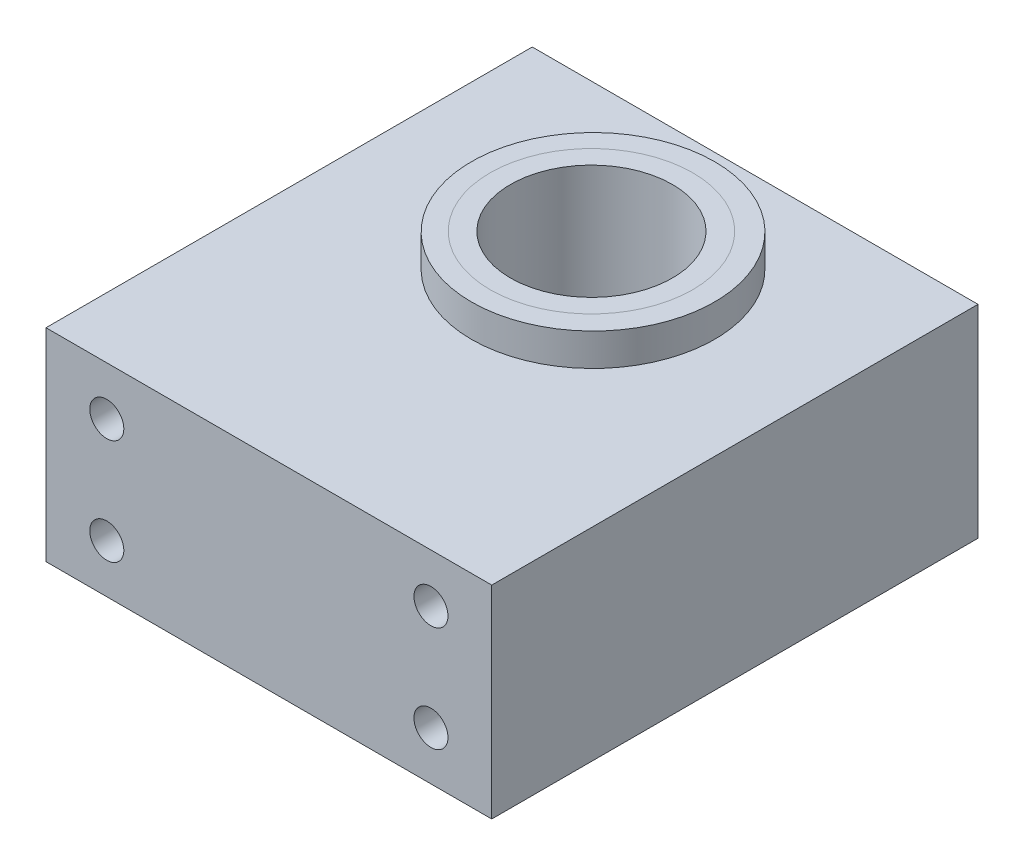
ISO-10303-21;
HEADER;
FILE_DESCRIPTION(('STEP AP214'),'2;1');
FILE_NAME('part.step','',(''),(''),'','','');
FILE_SCHEMA(('AUTOMOTIVE_DESIGN { 1 0 10303 214 1 1 1 1 }'));
ENDSEC;
DATA;
#1=APPLICATION_CONTEXT('core data for automotive mechanical design processes');
#2=APPLICATION_PROTOCOL_DEFINITION('international standard','automotive_design',2000,#1);
#3=PRODUCT_CONTEXT('',#1,'mechanical');
#4=PRODUCT('Part','Part','',(#3));
#5=PRODUCT_RELATED_PRODUCT_CATEGORY('part','',(#4));
#6=PRODUCT_DEFINITION_FORMATION('','',#4);
#7=PRODUCT_DEFINITION_CONTEXT('part definition',#1,'design');
#8=PRODUCT_DEFINITION('design','',#6,#7);
#9=PRODUCT_DEFINITION_SHAPE('','',#8);
#10=(LENGTH_UNIT() NAMED_UNIT(*) SI_UNIT(.MILLI.,.METRE.));
#11=(NAMED_UNIT(*) PLANE_ANGLE_UNIT() SI_UNIT($,.RADIAN.));
#12=(NAMED_UNIT(*) SI_UNIT($,.STERADIAN.) SOLID_ANGLE_UNIT());
#13=UNCERTAINTY_MEASURE_WITH_UNIT(LENGTH_MEASURE(1.E-05),#10,'distance_accuracy_value','');
#14=(GEOMETRIC_REPRESENTATION_CONTEXT(3) GLOBAL_UNCERTAINTY_ASSIGNED_CONTEXT((#13)) GLOBAL_UNIT_ASSIGNED_CONTEXT((#10,
#11,#12)) REPRESENTATION_CONTEXT('',''));
#15=CARTESIAN_POINT('',(0.,0.,0.));
#16=DIRECTION('',(0.,0.,1.));
#17=DIRECTION('',(1.,0.,0.));
#18=AXIS2_PLACEMENT_3D('',#15,#16,#17);
#19=CARTESIAN_POINT('',(-0.316230532057871,128.710678118655,0.0774764803540193));
#20=DIRECTION('',(0.,-1.,0.));
#21=DIRECTION('',(0.,0.,-1.));
#22=AXIS2_PLACEMENT_3D('',#19,#20,#21);
#23=CYLINDRICAL_SURFACE('',#22,25.);
#24=CARTESIAN_POINT('',(-0.316230532057871,0.,0.0774764803540193));
#25=DIRECTION('',(0.,1.,0.));
#26=DIRECTION('',(0.,0.,1.));
#27=AXIS2_PLACEMENT_3D('',#24,#25,#26);
#28=CIRCLE('',#27,25.);
#29=CARTESIAN_POINT('',(-0.316230532057871,0.,25.077476480354));
#30=VERTEX_POINT('',#29);
#31=EDGE_CURVE('E59',#30,#30,#28,.T.);
#32=ORIENTED_EDGE('',*,*,#31,.T.);
#33=EDGE_LOOP('',(#32));
#34=FACE_BOUND('',#33,.T.);
#35=CARTESIAN_POINT('',(-0.316230532057871,58.,0.0774764803540193));
#36=DIRECTION('',(0.,1.,0.));
#37=DIRECTION('',(0.,0.,1.));
#38=AXIS2_PLACEMENT_3D('',#35,#36,#37);
#39=CIRCLE('',#38,25.);
#40=CARTESIAN_POINT('',(-0.316230532057871,58.,25.077476480354));
#41=VERTEX_POINT('',#40);
#42=EDGE_CURVE('E11',#41,#41,#39,.T.);
#43=ORIENTED_EDGE('',*,*,#42,.F.);
#44=EDGE_LOOP('',(#43));
#45=FACE_BOUND('',#44,.T.);
#46=ADVANCED_FACE('F51',(#34,#45),#23,.T.);
#47=CARTESIAN_POINT('',(-0.316230532057871,0.,0.0774764803540193));
#48=DIRECTION('',(0.,1.,0.));
#49=DIRECTION('',(0.,0.,1.));
#50=AXIS2_PLACEMENT_3D('',#47,#48,#49);
#51=PLANE('',#50);
#52=ORIENTED_EDGE('',*,*,#31,.F.);
#53=EDGE_LOOP('',(#52));
#54=FACE_BOUND('',#53,.T.);
#55=CARTESIAN_POINT('',(-0.316230532057871,0.,0.0774764803540193));
#56=DIRECTION('',(0.,1.,0.));
#57=DIRECTION('',(0.,0.,1.));
#58=AXIS2_PLACEMENT_3D('',#55,#56,#57);
#59=CIRCLE('',#58,20.);
#60=CARTESIAN_POINT('',(-0.316230532057871,0.,20.077476480354));
#61=VERTEX_POINT('',#60);
#62=EDGE_CURVE('E65',#61,#61,#59,.T.);
#63=ORIENTED_EDGE('',*,*,#62,.T.);
#64=EDGE_LOOP('',(#63));
#65=FACE_BOUND('',#64,.T.);
#66=ADVANCED_FACE('F79',(#54,#65),#51,.F.);
#67=CARTESIAN_POINT('',(-0.316230532057871,128.710678118655,0.0774764803540193));
#68=DIRECTION('',(0.,-1.,0.));
#69=DIRECTION('',(0.,0.,-1.));
#70=AXIS2_PLACEMENT_3D('',#67,#68,#69);
#71=CYLINDRICAL_SURFACE('',#70,20.);
#72=ORIENTED_EDGE('',*,*,#62,.F.);
#73=EDGE_LOOP('',(#72));
#74=FACE_BOUND('',#73,.T.);
#75=CARTESIAN_POINT('',(-0.316230532057871,58.,0.0774764803540193));
#76=DIRECTION('',(0.,1.,0.));
#77=DIRECTION('',(0.,0.,1.));
#78=AXIS2_PLACEMENT_3D('',#75,#76,#77);
#79=CIRCLE('',#78,20.);
#80=CARTESIAN_POINT('',(-0.316230532057871,58.,20.077476480354));
#81=VERTEX_POINT('',#80);
#82=EDGE_CURVE('E53',#81,#81,#79,.T.);
#83=ORIENTED_EDGE('',*,*,#82,.T.);
#84=EDGE_LOOP('',(#83));
#85=FACE_BOUND('',#84,.T.);
#86=ADVANCED_FACE('F71',(#74,#85),#71,.F.);
#87=CARTESIAN_POINT('',(0.,58.,0.));
#88=DIRECTION('',(0.,1.,0.));
#89=DIRECTION('',(0.,0.,1.));
#90=AXIS2_PLACEMENT_3D('',#87,#88,#89);
#91=PLANE('',#90);
#92=ORIENTED_EDGE('',*,*,#82,.F.);
#93=EDGE_LOOP('',(#92));
#94=FACE_BOUND('',#93,.T.);
#95=ORIENTED_EDGE('',*,*,#42,.T.);
#96=EDGE_LOOP('',(#95));
#97=FACE_BOUND('',#96,.T.);
#98=ADVANCED_FACE('F73',(#94,#97),#91,.T.);
#99=CLOSED_SHELL('',(#46,#66,#86,#98));
#100=MANIFOLD_SOLID_BREP('B2',#99);
#101=CARTESIAN_POINT('',(-55.,50.,-40.));
#102=DIRECTION('',(1.,0.,0.));
#103=DIRECTION('',(0.,0.,-1.));
#104=AXIS2_PLACEMENT_3D('',#101,#102,#103);
#105=PLANE('',#104);
#106=DIRECTION('',(0.,0.,1.));
#107=VECTOR('',#106,1.);
#108=CARTESIAN_POINT('',(-55.,0.,-40.));
#109=LINE('',#108,#107);
#110=CARTESIAN_POINT('',(-55.,0.,-40.));
#111=VERTEX_POINT('',#110);
#112=CARTESIAN_POINT('',(-55.,0.,80.));
#113=VERTEX_POINT('',#112);
#114=EDGE_CURVE('E177',#111,#113,#109,.T.);
#115=ORIENTED_EDGE('',*,*,#114,.T.);
#116=DIRECTION('',(0.,-1.,0.));
#117=VECTOR('',#116,1.);
#118=CARTESIAN_POINT('',(-55.,50.,80.));
#119=LINE('',#118,#117);
#120=CARTESIAN_POINT('',(-55.,50.,80.));
#121=VERTEX_POINT('',#120);
#122=EDGE_CURVE('E116',#121,#113,#119,.T.);
#123=ORIENTED_EDGE('',*,*,#122,.F.);
#124=DIRECTION('',(0.,0.,1.));
#125=VECTOR('',#124,1.);
#126=CARTESIAN_POINT('',(-55.,50.,-40.));
#127=LINE('',#126,#125);
#128=CARTESIAN_POINT('',(-55.,50.,-40.));
#129=VERTEX_POINT('',#128);
#130=EDGE_CURVE('E168',#129,#121,#127,.T.);
#131=ORIENTED_EDGE('',*,*,#130,.F.);
#132=DIRECTION('',(0.,-1.,0.));
#133=VECTOR('',#132,1.);
#134=CARTESIAN_POINT('',(-55.,50.,-40.));
#135=LINE('',#134,#133);
#136=EDGE_CURVE('E174',#129,#111,#135,.T.);
#137=ORIENTED_EDGE('',*,*,#136,.T.);
#138=EDGE_LOOP('',(#115,#123,#131,#137));
#139=FACE_BOUND('',#138,.T.);
#140=ADVANCED_FACE('F113',(#139),#105,.F.);
#141=CARTESIAN_POINT('',(-55.,50.,80.));
#142=DIRECTION('',(0.,0.,-1.));
#143=DIRECTION('',(-1.,0.,0.));
#144=AXIS2_PLACEMENT_3D('',#141,#142,#143);
#145=PLANE('',#144);
#146=CARTESIAN_POINT('',(40.,38.,80.));
#147=DIRECTION('',(0.,0.,-1.));
#148=DIRECTION('',(-1.,0.,0.));
#149=AXIS2_PLACEMENT_3D('',#146,#147,#148);
#150=CIRCLE('',#149,4.19999999999997);
#151=CARTESIAN_POINT('',(35.8,38.,80.));
#152=VERTEX_POINT('',#151);
#153=EDGE_CURVE('E240',#152,#152,#150,.T.);
#154=ORIENTED_EDGE('',*,*,#153,.T.);
#155=EDGE_LOOP('',(#154));
#156=FACE_BOUND('',#155,.T.);
#157=CARTESIAN_POINT('',(-40.,38.,80.));
#158=DIRECTION('',(0.,0.,-1.));
#159=DIRECTION('',(-1.,0.,0.));
#160=AXIS2_PLACEMENT_3D('',#157,#158,#159);
#161=CIRCLE('',#160,4.19999999999997);
#162=CARTESIAN_POINT('',(-44.2,38.,80.));
#163=VERTEX_POINT('',#162);
#164=EDGE_CURVE('E224',#163,#163,#161,.T.);
#165=ORIENTED_EDGE('',*,*,#164,.T.);
#166=EDGE_LOOP('',(#165));
#167=FACE_BOUND('',#166,.T.);
#168=CARTESIAN_POINT('',(40.,12.,80.));
#169=DIRECTION('',(0.,0.,-1.));
#170=DIRECTION('',(-1.,0.,0.));
#171=AXIS2_PLACEMENT_3D('',#168,#169,#170);
#172=CIRCLE('',#171,4.19999999999997);
#173=CARTESIAN_POINT('',(35.8,12.,80.));
#174=VERTEX_POINT('',#173);
#175=EDGE_CURVE('E215',#174,#174,#172,.T.);
#176=ORIENTED_EDGE('',*,*,#175,.T.);
#177=EDGE_LOOP('',(#176));
#178=FACE_BOUND('',#177,.T.);
#179=CARTESIAN_POINT('',(-40.,12.,80.));
#180=DIRECTION('',(0.,0.,-1.));
#181=DIRECTION('',(-1.,0.,0.));
#182=AXIS2_PLACEMENT_3D('',#179,#180,#181);
#183=CIRCLE('',#182,4.19999999999997);
#184=CARTESIAN_POINT('',(-44.2,12.,80.));
#185=VERTEX_POINT('',#184);
#186=EDGE_CURVE('E201',#185,#185,#183,.T.);
#187=ORIENTED_EDGE('',*,*,#186,.T.);
#188=EDGE_LOOP('',(#187));
#189=FACE_BOUND('',#188,.T.);
#190=DIRECTION('',(1.,0.,0.));
#191=VECTOR('',#190,1.);
#192=CARTESIAN_POINT('',(-55.,0.,80.));
#193=LINE('',#192,#191);
#194=CARTESIAN_POINT('',(55.,0.,80.));
#195=VERTEX_POINT('',#194);
#196=EDGE_CURVE('E171',#113,#195,#193,.T.);
#197=ORIENTED_EDGE('',*,*,#196,.T.);
#198=DIRECTION('',(0.,-1.,0.));
#199=VECTOR('',#198,1.);
#200=CARTESIAN_POINT('',(55.,50.,80.));
#201=LINE('',#200,#199);
#202=CARTESIAN_POINT('',(55.,50.,80.));
#203=VERTEX_POINT('',#202);
#204=EDGE_CURVE('E169',#203,#195,#201,.T.);
#205=ORIENTED_EDGE('',*,*,#204,.F.);
#206=DIRECTION('',(1.,0.,0.));
#207=VECTOR('',#206,1.);
#208=CARTESIAN_POINT('',(-55.,50.,80.));
#209=LINE('',#208,#207);
#210=EDGE_CURVE('E163',#121,#203,#209,.T.);
#211=ORIENTED_EDGE('',*,*,#210,.F.);
#212=ORIENTED_EDGE('',*,*,#122,.T.);
#213=EDGE_LOOP('',(#197,#205,#211,#212));
#214=FACE_BOUND('',#213,.T.);
#215=ADVANCED_FACE('F167',(#156,#167,#178,#189,#214),#145,.F.);
#216=CARTESIAN_POINT('',(55.,50.,-40.));
#217=DIRECTION('',(-1.,0.,0.));
#218=DIRECTION('',(0.,0.,1.));
#219=AXIS2_PLACEMENT_3D('',#216,#217,#218);
#220=PLANE('',#219);
#221=DIRECTION('',(0.,0.,-1.));
#222=VECTOR('',#221,1.);
#223=CARTESIAN_POINT('',(55.,0.,-40.));
#224=LINE('',#223,#222);
#225=CARTESIAN_POINT('',(55.,0.,-40.));
#226=VERTEX_POINT('',#225);
#227=EDGE_CURVE('E149',#195,#226,#224,.T.);
#228=ORIENTED_EDGE('',*,*,#227,.T.);
#229=DIRECTION('',(0.,-1.,0.));
#230=VECTOR('',#229,1.);
#231=CARTESIAN_POINT('',(55.,50.,-40.));
#232=LINE('',#231,#230);
#233=CARTESIAN_POINT('',(55.,50.,-40.));
#234=VERTEX_POINT('',#233);
#235=EDGE_CURVE('E175',#234,#226,#232,.T.);
#236=ORIENTED_EDGE('',*,*,#235,.F.);
#237=DIRECTION('',(0.,0.,-1.));
#238=VECTOR('',#237,1.);
#239=CARTESIAN_POINT('',(55.,50.,-40.));
#240=LINE('',#239,#238);
#241=EDGE_CURVE('E165',#203,#234,#240,.T.);
#242=ORIENTED_EDGE('',*,*,#241,.F.);
#243=ORIENTED_EDGE('',*,*,#204,.T.);
#244=EDGE_LOOP('',(#228,#236,#242,#243));
#245=FACE_BOUND('',#244,.T.);
#246=ADVANCED_FACE('F173',(#245),#220,.F.);
#247=CARTESIAN_POINT('',(-55.,50.,-40.));
#248=DIRECTION('',(0.,0.,1.));
#249=DIRECTION('',(1.,0.,0.));
#250=AXIS2_PLACEMENT_3D('',#247,#248,#249);
#251=PLANE('',#250);
#252=CARTESIAN_POINT('',(40.,38.,-40.));
#253=DIRECTION('',(0.,0.,-1.));
#254=DIRECTION('',(-1.,0.,0.));
#255=AXIS2_PLACEMENT_3D('',#252,#253,#254);
#256=CIRCLE('',#255,7.5);
#257=CARTESIAN_POINT('',(32.5,38.,-40.));
#258=VERTEX_POINT('',#257);
#259=EDGE_CURVE('E246',#258,#258,#256,.T.);
#260=ORIENTED_EDGE('',*,*,#259,.F.);
#261=EDGE_LOOP('',(#260));
#262=FACE_BOUND('',#261,.T.);
#263=CARTESIAN_POINT('',(-40.,38.,-40.));
#264=DIRECTION('',(0.,0.,-1.));
#265=DIRECTION('',(-1.,0.,0.));
#266=AXIS2_PLACEMENT_3D('',#263,#264,#265);
#267=CIRCLE('',#266,7.5);
#268=CARTESIAN_POINT('',(-47.5,38.,-40.));
#269=VERTEX_POINT('',#268);
#270=EDGE_CURVE('E234',#269,#269,#267,.T.);
#271=ORIENTED_EDGE('',*,*,#270,.F.);
#272=EDGE_LOOP('',(#271));
#273=FACE_BOUND('',#272,.T.);
#274=CARTESIAN_POINT('',(40.,12.,-40.));
#275=DIRECTION('',(0.,0.,-1.));
#276=DIRECTION('',(-1.,0.,0.));
#277=AXIS2_PLACEMENT_3D('',#274,#275,#276);
#278=CIRCLE('',#277,7.5);
#279=CARTESIAN_POINT('',(32.5,12.,-40.));
#280=VERTEX_POINT('',#279);
#281=EDGE_CURVE('E225',#280,#280,#278,.T.);
#282=ORIENTED_EDGE('',*,*,#281,.F.);
#283=EDGE_LOOP('',(#282));
#284=FACE_BOUND('',#283,.T.);
#285=CARTESIAN_POINT('',(-40.,12.,-40.));
#286=DIRECTION('',(0.,0.,-1.));
#287=DIRECTION('',(-1.,0.,0.));
#288=AXIS2_PLACEMENT_3D('',#285,#286,#287);
#289=CIRCLE('',#288,7.5);
#290=CARTESIAN_POINT('',(-47.5,12.,-40.));
#291=VERTEX_POINT('',#290);
#292=EDGE_CURVE('E208',#291,#291,#289,.T.);
#293=ORIENTED_EDGE('',*,*,#292,.F.);
#294=EDGE_LOOP('',(#293));
#295=FACE_BOUND('',#294,.T.);
#296=DIRECTION('',(-1.,0.,0.));
#297=VECTOR('',#296,1.);
#298=CARTESIAN_POINT('',(-55.,0.,-40.));
#299=LINE('',#298,#297);
#300=EDGE_CURVE('E151',#226,#111,#299,.T.);
#301=ORIENTED_EDGE('',*,*,#300,.T.);
#302=ORIENTED_EDGE('',*,*,#136,.F.);
#303=DIRECTION('',(-1.,0.,0.));
#304=VECTOR('',#303,1.);
#305=CARTESIAN_POINT('',(-55.,50.,-40.));
#306=LINE('',#305,#304);
#307=EDGE_CURVE('E128',#234,#129,#306,.T.);
#308=ORIENTED_EDGE('',*,*,#307,.F.);
#309=ORIENTED_EDGE('',*,*,#235,.T.);
#310=EDGE_LOOP('',(#301,#302,#308,#309));
#311=FACE_BOUND('',#310,.T.);
#312=ADVANCED_FACE('F190',(#262,#273,#284,#295,#311),#251,.F.);
#313=CARTESIAN_POINT('',(0.,50.,0.));
#314=DIRECTION('',(0.,1.,0.));
#315=DIRECTION('',(0.,0.,1.));
#316=AXIS2_PLACEMENT_3D('',#313,#314,#315);
#317=PLANE('',#316);
#318=CARTESIAN_POINT('',(0.,50.,0.));
#319=DIRECTION('',(0.,1.,0.));
#320=DIRECTION('',(0.,0.,1.));
#321=AXIS2_PLACEMENT_3D('',#318,#319,#320);
#322=CIRCLE('',#321,30.);
#323=CARTESIAN_POINT('',(0.,50.,30.));
#324=VERTEX_POINT('',#323);
#325=EDGE_CURVE('E47',#324,#324,#322,.T.);
#326=ORIENTED_EDGE('',*,*,#325,.F.);
#327=EDGE_LOOP('',(#326));
#328=FACE_BOUND('',#327,.T.);
#329=ORIENTED_EDGE('',*,*,#130,.T.);
#330=ORIENTED_EDGE('',*,*,#210,.T.);
#331=ORIENTED_EDGE('',*,*,#241,.T.);
#332=ORIENTED_EDGE('',*,*,#307,.T.);
#333=EDGE_LOOP('',(#329,#330,#331,#332));
#334=FACE_BOUND('',#333,.T.);
#335=ADVANCED_FACE('F162',(#328,#334),#317,.T.);
#336=CARTESIAN_POINT('',(0.,0.,0.));
#337=DIRECTION('',(0.,1.,0.));
#338=DIRECTION('',(0.,0.,1.));
#339=AXIS2_PLACEMENT_3D('',#336,#337,#338);
#340=PLANE('',#339);
#341=CARTESIAN_POINT('',(-0.316230532057871,0.,0.0774764803540193));
#342=DIRECTION('',(0.,1.,0.));
#343=DIRECTION('',(0.,0.,1.));
#344=AXIS2_PLACEMENT_3D('',#341,#342,#343);
#345=CIRCLE('',#344,25.);
#346=CARTESIAN_POINT('',(-0.316230532057871,0.,25.077476480354));
#347=VERTEX_POINT('',#346);
#348=EDGE_CURVE('E196',#347,#347,#345,.T.);
#349=ORIENTED_EDGE('',*,*,#348,.T.);
#350=EDGE_LOOP('',(#349));
#351=FACE_BOUND('',#350,.T.);
#352=ORIENTED_EDGE('',*,*,#114,.F.);
#353=ORIENTED_EDGE('',*,*,#300,.F.);
#354=ORIENTED_EDGE('',*,*,#227,.F.);
#355=ORIENTED_EDGE('',*,*,#196,.F.);
#356=EDGE_LOOP('',(#352,#353,#354,#355));
#357=FACE_BOUND('',#356,.T.);
#358=ADVANCED_FACE('F188',(#351,#357),#340,.F.);
#359=CARTESIAN_POINT('',(0.,58.,0.));
#360=DIRECTION('',(0.,1.,0.));
#361=DIRECTION('',(0.,0.,1.));
#362=AXIS2_PLACEMENT_3D('',#359,#360,#361);
#363=PLANE('',#362);
#364=CARTESIAN_POINT('',(0.,58.,0.));
#365=DIRECTION('',(0.,1.,0.));
#366=DIRECTION('',(0.,0.,1.));
#367=AXIS2_PLACEMENT_3D('',#364,#365,#366);
#368=CIRCLE('',#367,30.);
#369=CARTESIAN_POINT('',(0.,58.,30.));
#370=VERTEX_POINT('',#369);
#371=EDGE_CURVE('E185',#370,#370,#368,.T.);
#372=ORIENTED_EDGE('',*,*,#371,.T.);
#373=EDGE_LOOP('',(#372));
#374=FACE_BOUND('',#373,.T.);
#375=CARTESIAN_POINT('',(-0.316230532057871,58.,0.0774764803540193));
#376=DIRECTION('',(0.,1.,0.));
#377=DIRECTION('',(0.,0.,1.));
#378=AXIS2_PLACEMENT_3D('',#375,#376,#377);
#379=CIRCLE('',#378,25.);
#380=CARTESIAN_POINT('',(-0.316230532057871,58.,25.077476480354));
#381=VERTEX_POINT('',#380);
#382=EDGE_CURVE('E193',#381,#381,#379,.T.);
#383=ORIENTED_EDGE('',*,*,#382,.F.);
#384=EDGE_LOOP('',(#383));
#385=FACE_BOUND('',#384,.T.);
#386=ADVANCED_FACE('F292',(#374,#385),#363,.T.);
#387=CARTESIAN_POINT('',(0.,58.,0.));
#388=DIRECTION('',(0.,-1.,0.));
#389=DIRECTION('',(0.,0.,-1.));
#390=AXIS2_PLACEMENT_3D('',#387,#388,#389);
#391=CYLINDRICAL_SURFACE('',#390,30.);
#392=ORIENTED_EDGE('',*,*,#371,.F.);
#393=EDGE_LOOP('',(#392));
#394=FACE_BOUND('',#393,.T.);
#395=ORIENTED_EDGE('',*,*,#325,.T.);
#396=EDGE_LOOP('',(#395));
#397=FACE_BOUND('',#396,.T.);
#398=ADVANCED_FACE('F300',(#394,#397),#391,.T.);
#399=CARTESIAN_POINT('',(-0.316230532057871,58.,0.0774764803540193));
#400=DIRECTION('',(0.,-1.,0.));
#401=DIRECTION('',(0.,0.,-1.));
#402=AXIS2_PLACEMENT_3D('',#399,#400,#401);
#403=CYLINDRICAL_SURFACE('',#402,25.);
#404=ORIENTED_EDGE('',*,*,#382,.T.);
#405=EDGE_LOOP('',(#404));
#406=FACE_BOUND('',#405,.T.);
#407=ORIENTED_EDGE('',*,*,#348,.F.);
#408=EDGE_LOOP('',(#407));
#409=FACE_BOUND('',#408,.T.);
#410=ADVANCED_FACE('F299',(#406,#409),#403,.F.);
#411=CARTESIAN_POINT('',(-40.,12.,-40.));
#412=DIRECTION('',(0.,0.,-1.));
#413=DIRECTION('',(-1.,0.,0.));
#414=AXIS2_PLACEMENT_3D('',#411,#412,#413);
#415=CYLINDRICAL_SURFACE('',#414,4.19999999999999);
#416=ORIENTED_EDGE('',*,*,#186,.F.);
#417=EDGE_LOOP('',(#416));
#418=FACE_BOUND('',#417,.T.);
#419=CARTESIAN_POINT('',(-40.,12.,-31.4));
#420=DIRECTION('',(0.,0.,-1.));
#421=DIRECTION('',(-1.,0.,0.));
#422=AXIS2_PLACEMENT_3D('',#419,#420,#421);
#423=CIRCLE('',#422,4.2);
#424=CARTESIAN_POINT('',(-44.2,12.,-31.4));
#425=VERTEX_POINT('',#424);
#426=EDGE_CURVE('E202',#425,#425,#423,.T.);
#427=ORIENTED_EDGE('',*,*,#426,.T.);
#428=EDGE_LOOP('',(#427));
#429=FACE_BOUND('',#428,.T.);
#430=ADVANCED_FACE('F274',(#418,#429),#415,.F.);
#431=CARTESIAN_POINT('',(-35.8,12.,-31.4));
#432=DIRECTION('',(0.,0.,1.));
#433=DIRECTION('',(1.,0.,0.));
#434=AXIS2_PLACEMENT_3D('',#431,#432,#433);
#435=PLANE('',#434);
#436=ORIENTED_EDGE('',*,*,#426,.F.);
#437=EDGE_LOOP('',(#436));
#438=FACE_BOUND('',#437,.T.);
#439=CARTESIAN_POINT('',(-40.,12.,-31.4));
#440=DIRECTION('',(0.,0.,-1.));
#441=DIRECTION('',(-1.,0.,0.));
#442=AXIS2_PLACEMENT_3D('',#439,#440,#441);
#443=CIRCLE('',#442,7.5);
#444=CARTESIAN_POINT('',(-47.5,12.,-31.4));
#445=VERTEX_POINT('',#444);
#446=EDGE_CURVE('E210',#445,#445,#443,.T.);
#447=ORIENTED_EDGE('',*,*,#446,.T.);
#448=EDGE_LOOP('',(#447));
#449=FACE_BOUND('',#448,.T.);
#450=ADVANCED_FACE('F264',(#438,#449),#435,.F.);
#451=CARTESIAN_POINT('',(-40.,12.,-40.));
#452=DIRECTION('',(0.,0.,-1.));
#453=DIRECTION('',(-1.,0.,0.));
#454=AXIS2_PLACEMENT_3D('',#451,#452,#453);
#455=CYLINDRICAL_SURFACE('',#454,7.5);
#456=ORIENTED_EDGE('',*,*,#446,.F.);
#457=EDGE_LOOP('',(#456));
#458=FACE_BOUND('',#457,.T.);
#459=ORIENTED_EDGE('',*,*,#292,.T.);
#460=EDGE_LOOP('',(#459));
#461=FACE_BOUND('',#460,.T.);
#462=ADVANCED_FACE('F263',(#458,#461),#455,.F.);
#463=CARTESIAN_POINT('',(40.,12.,-40.));
#464=DIRECTION('',(0.,0.,-1.));
#465=DIRECTION('',(-1.,0.,0.));
#466=AXIS2_PLACEMENT_3D('',#463,#464,#465);
#467=CYLINDRICAL_SURFACE('',#466,4.19999999999999);
#468=ORIENTED_EDGE('',*,*,#175,.F.);
#469=EDGE_LOOP('',(#468));
#470=FACE_BOUND('',#469,.T.);
#471=CARTESIAN_POINT('',(40.,12.,-31.4));
#472=DIRECTION('',(0.,0.,-1.));
#473=DIRECTION('',(-1.,0.,0.));
#474=AXIS2_PLACEMENT_3D('',#471,#472,#473);
#475=CIRCLE('',#474,4.2);
#476=CARTESIAN_POINT('',(35.8,12.,-31.4));
#477=VERTEX_POINT('',#476);
#478=EDGE_CURVE('E218',#477,#477,#475,.T.);
#479=ORIENTED_EDGE('',*,*,#478,.T.);
#480=EDGE_LOOP('',(#479));
#481=FACE_BOUND('',#480,.T.);
#482=ADVANCED_FACE('F261',(#470,#481),#467,.F.);
#483=CARTESIAN_POINT('',(44.2,12.,-31.4));
#484=DIRECTION('',(0.,0.,1.));
#485=DIRECTION('',(1.,0.,0.));
#486=AXIS2_PLACEMENT_3D('',#483,#484,#485);
#487=PLANE('',#486);
#488=ORIENTED_EDGE('',*,*,#478,.F.);
#489=EDGE_LOOP('',(#488));
#490=FACE_BOUND('',#489,.T.);
#491=CARTESIAN_POINT('',(40.,12.,-31.4));
#492=DIRECTION('',(0.,0.,-1.));
#493=DIRECTION('',(-1.,0.,0.));
#494=AXIS2_PLACEMENT_3D('',#491,#492,#493);
#495=CIRCLE('',#494,7.5);
#496=CARTESIAN_POINT('',(32.5,12.,-31.4));
#497=VERTEX_POINT('',#496);
#498=EDGE_CURVE('E219',#497,#497,#495,.T.);
#499=ORIENTED_EDGE('',*,*,#498,.T.);
#500=EDGE_LOOP('',(#499));
#501=FACE_BOUND('',#500,.T.);
#502=ADVANCED_FACE('F272',(#490,#501),#487,.F.);
#503=CARTESIAN_POINT('',(40.,12.,-40.));
#504=DIRECTION('',(0.,0.,-1.));
#505=DIRECTION('',(-1.,0.,0.));
#506=AXIS2_PLACEMENT_3D('',#503,#504,#505);
#507=CYLINDRICAL_SURFACE('',#506,7.5);
#508=ORIENTED_EDGE('',*,*,#498,.F.);
#509=EDGE_LOOP('',(#508));
#510=FACE_BOUND('',#509,.T.);
#511=ORIENTED_EDGE('',*,*,#281,.T.);
#512=EDGE_LOOP('',(#511));
#513=FACE_BOUND('',#512,.T.);
#514=ADVANCED_FACE('F418',(#510,#513),#507,.F.);
#515=CARTESIAN_POINT('',(-40.,38.,-40.));
#516=DIRECTION('',(0.,0.,-1.));
#517=DIRECTION('',(-1.,0.,0.));
#518=AXIS2_PLACEMENT_3D('',#515,#516,#517);
#519=CYLINDRICAL_SURFACE('',#518,4.19999999999999);
#520=ORIENTED_EDGE('',*,*,#164,.F.);
#521=EDGE_LOOP('',(#520));
#522=FACE_BOUND('',#521,.T.);
#523=CARTESIAN_POINT('',(-40.,38.,-31.4));
#524=DIRECTION('',(0.,0.,-1.));
#525=DIRECTION('',(-1.,0.,0.));
#526=AXIS2_PLACEMENT_3D('',#523,#524,#525);
#527=CIRCLE('',#526,4.2);
#528=CARTESIAN_POINT('',(-44.2,38.,-31.4));
#529=VERTEX_POINT('',#528);
#530=EDGE_CURVE('E226',#529,#529,#527,.T.);
#531=ORIENTED_EDGE('',*,*,#530,.T.);
#532=EDGE_LOOP('',(#531));
#533=FACE_BOUND('',#532,.T.);
#534=ADVANCED_FACE('F426',(#522,#533),#519,.F.);
#535=CARTESIAN_POINT('',(-35.8,38.,-31.4));
#536=DIRECTION('',(0.,0.,1.));
#537=DIRECTION('',(1.,0.,0.));
#538=AXIS2_PLACEMENT_3D('',#535,#536,#537);
#539=PLANE('',#538);
#540=ORIENTED_EDGE('',*,*,#530,.F.);
#541=EDGE_LOOP('',(#540));
#542=FACE_BOUND('',#541,.T.);
#543=CARTESIAN_POINT('',(-40.,38.,-31.4));
#544=DIRECTION('',(0.,0.,-1.));
#545=DIRECTION('',(-1.,0.,0.));
#546=AXIS2_PLACEMENT_3D('',#543,#544,#545);
#547=CIRCLE('',#546,7.5);
#548=CARTESIAN_POINT('',(-47.5,38.,-31.4));
#549=VERTEX_POINT('',#548);
#550=EDGE_CURVE('E233',#549,#549,#547,.T.);
#551=ORIENTED_EDGE('',*,*,#550,.T.);
#552=EDGE_LOOP('',(#551));
#553=FACE_BOUND('',#552,.T.);
#554=ADVANCED_FACE('F438',(#542,#553),#539,.F.);
#555=CARTESIAN_POINT('',(-40.,38.,-40.));
#556=DIRECTION('',(0.,0.,-1.));
#557=DIRECTION('',(-1.,0.,0.));
#558=AXIS2_PLACEMENT_3D('',#555,#556,#557);
#559=CYLINDRICAL_SURFACE('',#558,7.5);
#560=ORIENTED_EDGE('',*,*,#550,.F.);
#561=EDGE_LOOP('',(#560));
#562=FACE_BOUND('',#561,.T.);
#563=ORIENTED_EDGE('',*,*,#270,.T.);
#564=EDGE_LOOP('',(#563));
#565=FACE_BOUND('',#564,.T.);
#566=ADVANCED_FACE('F449',(#562,#565),#559,.F.);
#567=CARTESIAN_POINT('',(40.,38.,-40.));
#568=DIRECTION('',(0.,0.,-1.));
#569=DIRECTION('',(-1.,0.,0.));
#570=AXIS2_PLACEMENT_3D('',#567,#568,#569);
#571=CYLINDRICAL_SURFACE('',#570,4.19999999999999);
#572=ORIENTED_EDGE('',*,*,#153,.F.);
#573=EDGE_LOOP('',(#572));
#574=FACE_BOUND('',#573,.T.);
#575=CARTESIAN_POINT('',(40.,38.,-31.4));
#576=DIRECTION('',(0.,0.,-1.));
#577=DIRECTION('',(-1.,0.,0.));
#578=AXIS2_PLACEMENT_3D('',#575,#576,#577);
#579=CIRCLE('',#578,4.2);
#580=CARTESIAN_POINT('',(35.8,38.,-31.4));
#581=VERTEX_POINT('',#580);
#582=EDGE_CURVE('E239',#581,#581,#579,.T.);
#583=ORIENTED_EDGE('',*,*,#582,.T.);
#584=EDGE_LOOP('',(#583));
#585=FACE_BOUND('',#584,.T.);
#586=ADVANCED_FACE('F456',(#574,#585),#571,.F.);
#587=CARTESIAN_POINT('',(44.2,38.,-31.4));
#588=DIRECTION('',(0.,0.,1.));
#589=DIRECTION('',(1.,0.,0.));
#590=AXIS2_PLACEMENT_3D('',#587,#588,#589);
#591=PLANE('',#590);
#592=ORIENTED_EDGE('',*,*,#582,.F.);
#593=EDGE_LOOP('',(#592));
#594=FACE_BOUND('',#593,.T.);
#595=CARTESIAN_POINT('',(40.,38.,-31.4));
#596=DIRECTION('',(0.,0.,-1.));
#597=DIRECTION('',(-1.,0.,0.));
#598=AXIS2_PLACEMENT_3D('',#595,#596,#597);
#599=CIRCLE('',#598,7.5);
#600=CARTESIAN_POINT('',(32.5,38.,-31.4));
#601=VERTEX_POINT('',#600);
#602=EDGE_CURVE('E243',#601,#601,#599,.T.);
#603=ORIENTED_EDGE('',*,*,#602,.T.);
#604=EDGE_LOOP('',(#603));
#605=FACE_BOUND('',#604,.T.);
#606=ADVANCED_FACE('F466',(#594,#605),#591,.F.);
#607=CARTESIAN_POINT('',(40.,38.,-40.));
#608=DIRECTION('',(0.,0.,-1.));
#609=DIRECTION('',(-1.,0.,0.));
#610=AXIS2_PLACEMENT_3D('',#607,#608,#609);
#611=CYLINDRICAL_SURFACE('',#610,7.5);
#612=ORIENTED_EDGE('',*,*,#602,.F.);
#613=EDGE_LOOP('',(#612));
#614=FACE_BOUND('',#613,.T.);
#615=ORIENTED_EDGE('',*,*,#259,.T.);
#616=EDGE_LOOP('',(#615));
#617=FACE_BOUND('',#616,.T.);
#618=ADVANCED_FACE('F249',(#614,#617),#611,.F.);
#619=CLOSED_SHELL('',(#140,#215,#246,#312,#335,#358,#386,#398,#410,#430,#450,#462,#482,#502,
#514,#534,#554,#566,#586,#606,#618));
#620=MANIFOLD_SOLID_BREP('B6',#619);
#621=ADVANCED_BREP_SHAPE_REPRESENTATION('',(#18,#100,#620),#14);
#622=SHAPE_DEFINITION_REPRESENTATION(#9,#621);
ENDSEC;
END-ISO-10303-21;
